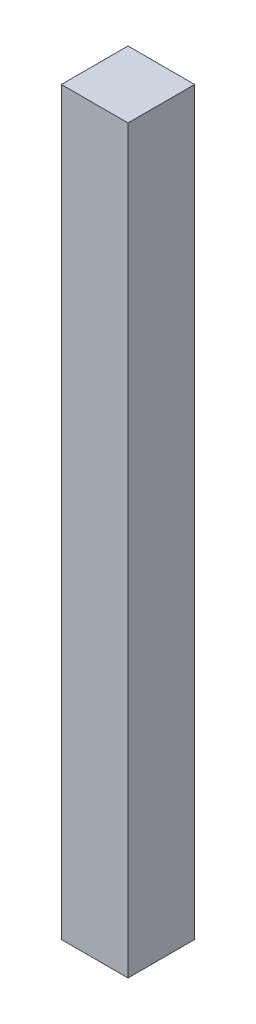
ISO-10303-21;
HEADER;
FILE_DESCRIPTION(('STEP AP214'),'2;1');
FILE_NAME('part.step','',(''),(''),'','','');
FILE_SCHEMA(('AUTOMOTIVE_DESIGN { 1 0 10303 214 1 1 1 1 }'));
ENDSEC;
DATA;
#1=APPLICATION_CONTEXT('core data for automotive mechanical design processes');
#2=APPLICATION_PROTOCOL_DEFINITION('international standard','automotive_design',2000,#1);
#3=PRODUCT_CONTEXT('',#1,'mechanical');
#4=PRODUCT('Part','Part','',(#3));
#5=PRODUCT_RELATED_PRODUCT_CATEGORY('part','',(#4));
#6=PRODUCT_DEFINITION_FORMATION('','',#4);
#7=PRODUCT_DEFINITION_CONTEXT('part definition',#1,'design');
#8=PRODUCT_DEFINITION('design','',#6,#7);
#9=PRODUCT_DEFINITION_SHAPE('','',#8);
#10=(LENGTH_UNIT() NAMED_UNIT(*) SI_UNIT(.MILLI.,.METRE.));
#11=(NAMED_UNIT(*) PLANE_ANGLE_UNIT() SI_UNIT($,.RADIAN.));
#12=(NAMED_UNIT(*) SI_UNIT($,.STERADIAN.) SOLID_ANGLE_UNIT());
#13=UNCERTAINTY_MEASURE_WITH_UNIT(LENGTH_MEASURE(1.E-05),#10,'distance_accuracy_value','');
#14=(GEOMETRIC_REPRESENTATION_CONTEXT(3) GLOBAL_UNCERTAINTY_ASSIGNED_CONTEXT((#13)) GLOBAL_UNIT_ASSIGNED_CONTEXT((#10,
#11,#12)) REPRESENTATION_CONTEXT('',''));
#15=CARTESIAN_POINT('',(0.,0.,0.));
#16=DIRECTION('',(0.,0.,1.));
#17=DIRECTION('',(1.,0.,0.));
#18=AXIS2_PLACEMENT_3D('',#15,#16,#17);
#19=CARTESIAN_POINT('',(637.,770.,26.));
#20=DIRECTION('',(1.,0.,0.));
#21=DIRECTION('',(0.,0.,-1.));
#22=AXIS2_PLACEMENT_3D('',#19,#20,#21);
#23=PLANE('',#22);
#24=DIRECTION('',(0.,-1.,0.));
#25=VECTOR('',#24,1.);
#26=CARTESIAN_POINT('',(637.,770.,8.));
#27=LINE('',#26,#25);
#28=CARTESIAN_POINT('',(637.,970.,8.));
#29=VERTEX_POINT('',#28);
#30=CARTESIAN_POINT('',(637.,770.,8.));
#31=VERTEX_POINT('',#30);
#32=EDGE_CURVE('E102',#29,#31,#27,.T.);
#33=ORIENTED_EDGE('',*,*,#32,.T.);
#34=DIRECTION('',(0.,0.,-1.));
#35=VECTOR('',#34,1.);
#36=CARTESIAN_POINT('',(637.,770.,26.));
#37=LINE('',#36,#35);
#38=CARTESIAN_POINT('',(637.,770.,26.));
#39=VERTEX_POINT('',#38);
#40=EDGE_CURVE('E11',#39,#31,#37,.T.);
#41=ORIENTED_EDGE('',*,*,#40,.F.);
#42=DIRECTION('',(0.,-1.,0.));
#43=VECTOR('',#42,1.);
#44=CARTESIAN_POINT('',(637.,770.,26.));
#45=LINE('',#44,#43);
#46=CARTESIAN_POINT('',(637.,970.,26.));
#47=VERTEX_POINT('',#46);
#48=EDGE_CURVE('E90',#47,#39,#45,.T.);
#49=ORIENTED_EDGE('',*,*,#48,.F.);
#50=DIRECTION('',(0.,0.,-1.));
#51=VECTOR('',#50,1.);
#52=CARTESIAN_POINT('',(637.,970.,26.));
#53=LINE('',#52,#51);
#54=EDGE_CURVE('E98',#47,#29,#53,.T.);
#55=ORIENTED_EDGE('',*,*,#54,.T.);
#56=EDGE_LOOP('',(#33,#41,#49,#55));
#57=FACE_BOUND('',#56,.T.);
#58=ADVANCED_FACE('F39',(#57),#23,.F.);
#59=CARTESIAN_POINT('',(637.,770.,26.));
#60=DIRECTION('',(0.,1.,0.));
#61=DIRECTION('',(0.,0.,1.));
#62=AXIS2_PLACEMENT_3D('',#59,#60,#61);
#63=PLANE('',#62);
#64=DIRECTION('',(1.,0.,0.));
#65=VECTOR('',#64,1.);
#66=CARTESIAN_POINT('',(637.,770.,8.));
#67=LINE('',#66,#65);
#68=CARTESIAN_POINT('',(655.,770.,8.));
#69=VERTEX_POINT('',#68);
#70=EDGE_CURVE('E94',#31,#69,#67,.T.);
#71=ORIENTED_EDGE('',*,*,#70,.T.);
#72=DIRECTION('',(0.,0.,-1.));
#73=VECTOR('',#72,1.);
#74=CARTESIAN_POINT('',(655.,770.,26.));
#75=LINE('',#74,#73);
#76=CARTESIAN_POINT('',(655.,770.,26.));
#77=VERTEX_POINT('',#76);
#78=EDGE_CURVE('E47',#77,#69,#75,.T.);
#79=ORIENTED_EDGE('',*,*,#78,.F.);
#80=DIRECTION('',(1.,0.,0.));
#81=VECTOR('',#80,1.);
#82=CARTESIAN_POINT('',(637.,770.,26.));
#83=LINE('',#82,#81);
#84=EDGE_CURVE('E85',#39,#77,#83,.T.);
#85=ORIENTED_EDGE('',*,*,#84,.F.);
#86=ORIENTED_EDGE('',*,*,#40,.T.);
#87=EDGE_LOOP('',(#71,#79,#85,#86));
#88=FACE_BOUND('',#87,.T.);
#89=ADVANCED_FACE('F93',(#88),#63,.F.);
#90=CARTESIAN_POINT('',(655.,770.,26.));
#91=DIRECTION('',(-1.,0.,0.));
#92=DIRECTION('',(0.,0.,1.));
#93=AXIS2_PLACEMENT_3D('',#90,#91,#92);
#94=PLANE('',#93);
#95=DIRECTION('',(0.,1.,0.));
#96=VECTOR('',#95,1.);
#97=CARTESIAN_POINT('',(655.,770.,8.));
#98=LINE('',#97,#96);
#99=CARTESIAN_POINT('',(655.,970.,8.));
#100=VERTEX_POINT('',#99);
#101=EDGE_CURVE('E72',#69,#100,#98,.T.);
#102=ORIENTED_EDGE('',*,*,#101,.T.);
#103=DIRECTION('',(0.,0.,-1.));
#104=VECTOR('',#103,1.);
#105=CARTESIAN_POINT('',(655.,970.,26.));
#106=LINE('',#105,#104);
#107=CARTESIAN_POINT('',(655.,970.,26.));
#108=VERTEX_POINT('',#107);
#109=EDGE_CURVE('E95',#108,#100,#106,.T.);
#110=ORIENTED_EDGE('',*,*,#109,.F.);
#111=DIRECTION('',(0.,1.,0.));
#112=VECTOR('',#111,1.);
#113=CARTESIAN_POINT('',(655.,770.,26.));
#114=LINE('',#113,#112);
#115=EDGE_CURVE('E88',#77,#108,#114,.T.);
#116=ORIENTED_EDGE('',*,*,#115,.F.);
#117=ORIENTED_EDGE('',*,*,#78,.T.);
#118=EDGE_LOOP('',(#102,#110,#116,#117));
#119=FACE_BOUND('',#118,.T.);
#120=ADVANCED_FACE('F96',(#119),#94,.F.);
#121=CARTESIAN_POINT('',(637.,970.,26.));
#122=DIRECTION('',(0.,-1.,0.));
#123=DIRECTION('',(0.,0.,-1.));
#124=AXIS2_PLACEMENT_3D('',#121,#122,#123);
#125=PLANE('',#124);
#126=DIRECTION('',(-1.,0.,0.));
#127=VECTOR('',#126,1.);
#128=CARTESIAN_POINT('',(637.,970.,8.));
#129=LINE('',#128,#127);
#130=EDGE_CURVE('E78',#100,#29,#129,.T.);
#131=ORIENTED_EDGE('',*,*,#130,.T.);
#132=ORIENTED_EDGE('',*,*,#54,.F.);
#133=DIRECTION('',(-1.,0.,0.));
#134=VECTOR('',#133,1.);
#135=CARTESIAN_POINT('',(637.,970.,26.));
#136=LINE('',#135,#134);
#137=EDGE_CURVE('E55',#108,#47,#136,.T.);
#138=ORIENTED_EDGE('',*,*,#137,.F.);
#139=ORIENTED_EDGE('',*,*,#109,.T.);
#140=EDGE_LOOP('',(#131,#132,#138,#139));
#141=FACE_BOUND('',#140,.T.);
#142=ADVANCED_FACE('F109',(#141),#125,.F.);
#143=CARTESIAN_POINT('',(0.,0.,26.));
#144=DIRECTION('',(0.,0.,-1.));
#145=DIRECTION('',(-1.,0.,0.));
#146=AXIS2_PLACEMENT_3D('',#143,#144,#145);
#147=PLANE('',#146);
#148=ORIENTED_EDGE('',*,*,#48,.T.);
#149=ORIENTED_EDGE('',*,*,#84,.T.);
#150=ORIENTED_EDGE('',*,*,#115,.T.);
#151=ORIENTED_EDGE('',*,*,#137,.T.);
#152=EDGE_LOOP('',(#148,#149,#150,#151));
#153=FACE_BOUND('',#152,.T.);
#154=ADVANCED_FACE('F86',(#153),#147,.F.);
#155=CARTESIAN_POINT('',(0.,0.,8.));
#156=DIRECTION('',(0.,0.,-1.));
#157=DIRECTION('',(-1.,0.,0.));
#158=AXIS2_PLACEMENT_3D('',#155,#156,#157);
#159=PLANE('',#158);
#160=ORIENTED_EDGE('',*,*,#32,.F.);
#161=ORIENTED_EDGE('',*,*,#130,.F.);
#162=ORIENTED_EDGE('',*,*,#101,.F.);
#163=ORIENTED_EDGE('',*,*,#70,.F.);
#164=EDGE_LOOP('',(#160,#161,#162,#163));
#165=FACE_BOUND('',#164,.T.);
#166=ADVANCED_FACE('F112',(#165),#159,.T.);
#167=CLOSED_SHELL('',(#58,#89,#120,#142,#154,#166));
#168=MANIFOLD_SOLID_BREP('B2',#167);
#169=ADVANCED_BREP_SHAPE_REPRESENTATION('',(#18,#168),#14);
#170=SHAPE_DEFINITION_REPRESENTATION(#9,#169);
ENDSEC;
END-ISO-10303-21;
